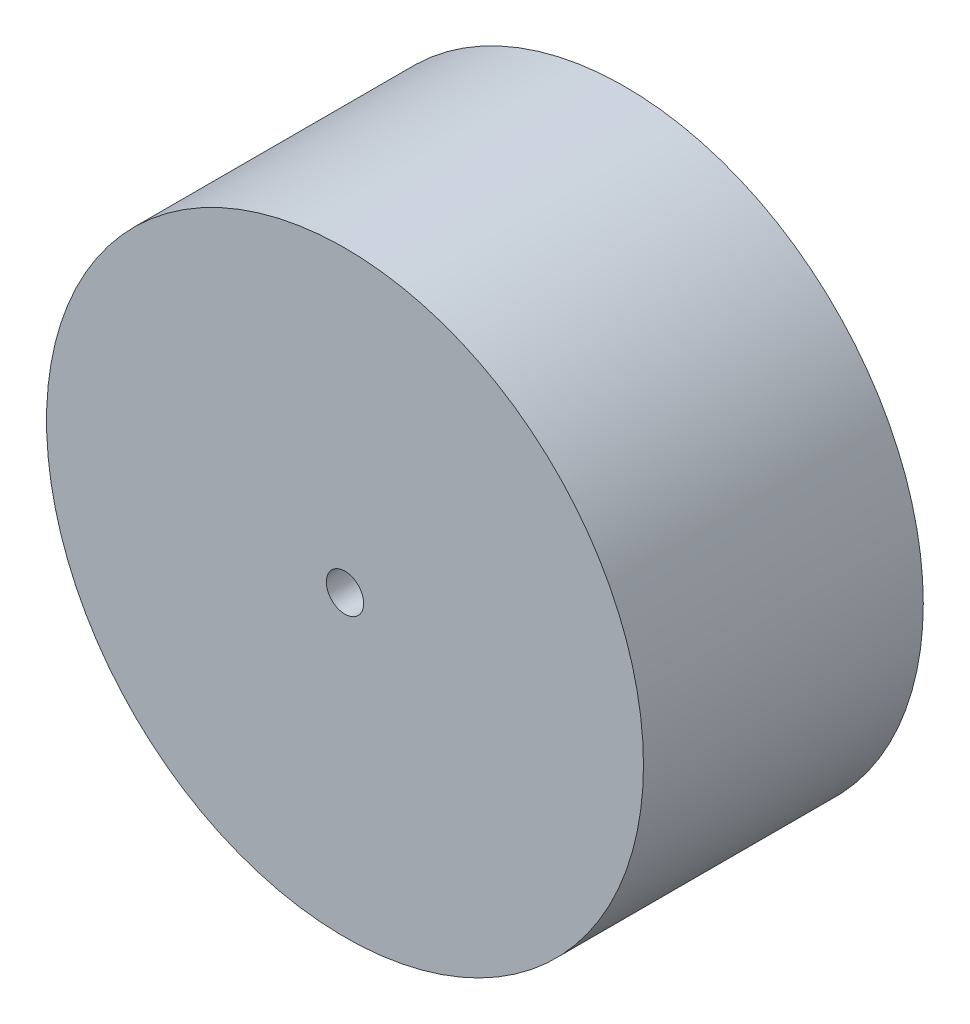
ISO-10303-21;
HEADER;
FILE_DESCRIPTION(('STEP AP214'),'2;1');
FILE_NAME('part.step','',(''),(''),'','','');
FILE_SCHEMA(('AUTOMOTIVE_DESIGN { 1 0 10303 214 1 1 1 1 }'));
ENDSEC;
DATA;
#1=APPLICATION_CONTEXT('core data for automotive mechanical design processes');
#2=APPLICATION_PROTOCOL_DEFINITION('international standard','automotive_design',2000,#1);
#3=PRODUCT_CONTEXT('',#1,'mechanical');
#4=PRODUCT('Part','Part','',(#3));
#5=PRODUCT_RELATED_PRODUCT_CATEGORY('part','',(#4));
#6=PRODUCT_DEFINITION_FORMATION('','',#4);
#7=PRODUCT_DEFINITION_CONTEXT('part definition',#1,'design');
#8=PRODUCT_DEFINITION('design','',#6,#7);
#9=PRODUCT_DEFINITION_SHAPE('','',#8);
#10=(LENGTH_UNIT() NAMED_UNIT(*) SI_UNIT(.MILLI.,.METRE.));
#11=(NAMED_UNIT(*) PLANE_ANGLE_UNIT() SI_UNIT($,.RADIAN.));
#12=(NAMED_UNIT(*) SI_UNIT($,.STERADIAN.) SOLID_ANGLE_UNIT());
#13=UNCERTAINTY_MEASURE_WITH_UNIT(LENGTH_MEASURE(1.E-05),#10,'distance_accuracy_value','');
#14=(GEOMETRIC_REPRESENTATION_CONTEXT(3) GLOBAL_UNCERTAINTY_ASSIGNED_CONTEXT((#13)) GLOBAL_UNIT_ASSIGNED_CONTEXT((#10,
#11,#12)) REPRESENTATION_CONTEXT('',''));
#15=CARTESIAN_POINT('',(0.,0.,0.));
#16=DIRECTION('',(0.,0.,1.));
#17=DIRECTION('',(1.,0.,0.));
#18=AXIS2_PLACEMENT_3D('',#15,#16,#17);
#19=CARTESIAN_POINT('',(0.,0.,-37.5));
#20=DIRECTION('',(0.,0.,1.));
#21=DIRECTION('',(1.,0.,0.));
#22=AXIS2_PLACEMENT_3D('',#19,#20,#21);
#23=CYLINDRICAL_SURFACE('',#22,40.);
#24=CARTESIAN_POINT('',(0.,0.,-37.5));
#25=DIRECTION('',(0.,0.,1.));
#26=DIRECTION('',(1.,0.,0.));
#27=AXIS2_PLACEMENT_3D('',#24,#25,#26);
#28=CIRCLE('',#27,40.);
#29=CARTESIAN_POINT('',(40.,0.,-37.5));
#30=VERTEX_POINT('',#29);
#31=EDGE_CURVE('E10',#30,#30,#28,.T.);
#32=ORIENTED_EDGE('',*,*,#31,.T.);
#33=EDGE_LOOP('',(#32));
#34=FACE_BOUND('',#33,.T.);
#35=CARTESIAN_POINT('',(0.,0.,0.));
#36=DIRECTION('',(0.,0.,1.));
#37=DIRECTION('',(1.,0.,0.));
#38=AXIS2_PLACEMENT_3D('',#35,#36,#37);
#39=CIRCLE('',#38,40.);
#40=CARTESIAN_POINT('',(40.,0.,0.));
#41=VERTEX_POINT('',#40);
#42=EDGE_CURVE('E34',#41,#41,#39,.T.);
#43=ORIENTED_EDGE('',*,*,#42,.F.);
#44=EDGE_LOOP('',(#43));
#45=FACE_BOUND('',#44,.T.);
#46=ADVANCED_FACE('F31',(#34,#45),#23,.T.);
#47=CARTESIAN_POINT('',(0.,0.,-37.5));
#48=DIRECTION('',(0.,0.,1.));
#49=DIRECTION('',(1.,0.,0.));
#50=AXIS2_PLACEMENT_3D('',#47,#48,#49);
#51=PLANE('',#50);
#52=CARTESIAN_POINT('',(0.,0.,-37.5));
#53=DIRECTION('',(0.,0.,1.));
#54=DIRECTION('',(1.,0.,0.));
#55=AXIS2_PLACEMENT_3D('',#52,#53,#54);
#56=CIRCLE('',#55,2.5);
#57=CARTESIAN_POINT('',(2.5,0.,-37.5));
#58=VERTEX_POINT('',#57);
#59=EDGE_CURVE('E41',#58,#58,#56,.T.);
#60=ORIENTED_EDGE('',*,*,#59,.T.);
#61=EDGE_LOOP('',(#60));
#62=FACE_BOUND('',#61,.T.);
#63=ORIENTED_EDGE('',*,*,#31,.F.);
#64=EDGE_LOOP('',(#63));
#65=FACE_BOUND('',#64,.T.);
#66=ADVANCED_FACE('F49',(#62,#65),#51,.F.);
#67=CARTESIAN_POINT('',(0.,0.,0.));
#68=DIRECTION('',(0.,0.,1.));
#69=DIRECTION('',(1.,0.,0.));
#70=AXIS2_PLACEMENT_3D('',#67,#68,#69);
#71=PLANE('',#70);
#72=CARTESIAN_POINT('',(0.,0.,0.));
#73=DIRECTION('',(0.,0.,1.));
#74=DIRECTION('',(1.,0.,0.));
#75=AXIS2_PLACEMENT_3D('',#72,#73,#74);
#76=CIRCLE('',#75,2.5);
#77=CARTESIAN_POINT('',(2.5,0.,0.));
#78=VERTEX_POINT('',#77);
#79=EDGE_CURVE('E43',#78,#78,#76,.T.);
#80=ORIENTED_EDGE('',*,*,#79,.F.);
#81=EDGE_LOOP('',(#80));
#82=FACE_BOUND('',#81,.T.);
#83=ORIENTED_EDGE('',*,*,#42,.T.);
#84=EDGE_LOOP('',(#83));
#85=FACE_BOUND('',#84,.T.);
#86=ADVANCED_FACE('F55',(#82,#85),#71,.T.);
#87=CARTESIAN_POINT('',(0.,0.,-37.5));
#88=DIRECTION('',(0.,0.,1.));
#89=DIRECTION('',(1.,0.,0.));
#90=AXIS2_PLACEMENT_3D('',#87,#88,#89);
#91=CYLINDRICAL_SURFACE('',#90,2.5);
#92=ORIENTED_EDGE('',*,*,#59,.F.);
#93=EDGE_LOOP('',(#92));
#94=FACE_BOUND('',#93,.T.);
#95=ORIENTED_EDGE('',*,*,#79,.T.);
#96=EDGE_LOOP('',(#95));
#97=FACE_BOUND('',#96,.T.);
#98=ADVANCED_FACE('F52',(#94,#97),#91,.F.);
#99=CLOSED_SHELL('',(#46,#66,#86,#98));
#100=MANIFOLD_SOLID_BREP('B2',#99);
#101=ADVANCED_BREP_SHAPE_REPRESENTATION('',(#18,#100),#14);
#102=SHAPE_DEFINITION_REPRESENTATION(#9,#101);
ENDSEC;
END-ISO-10303-21;
